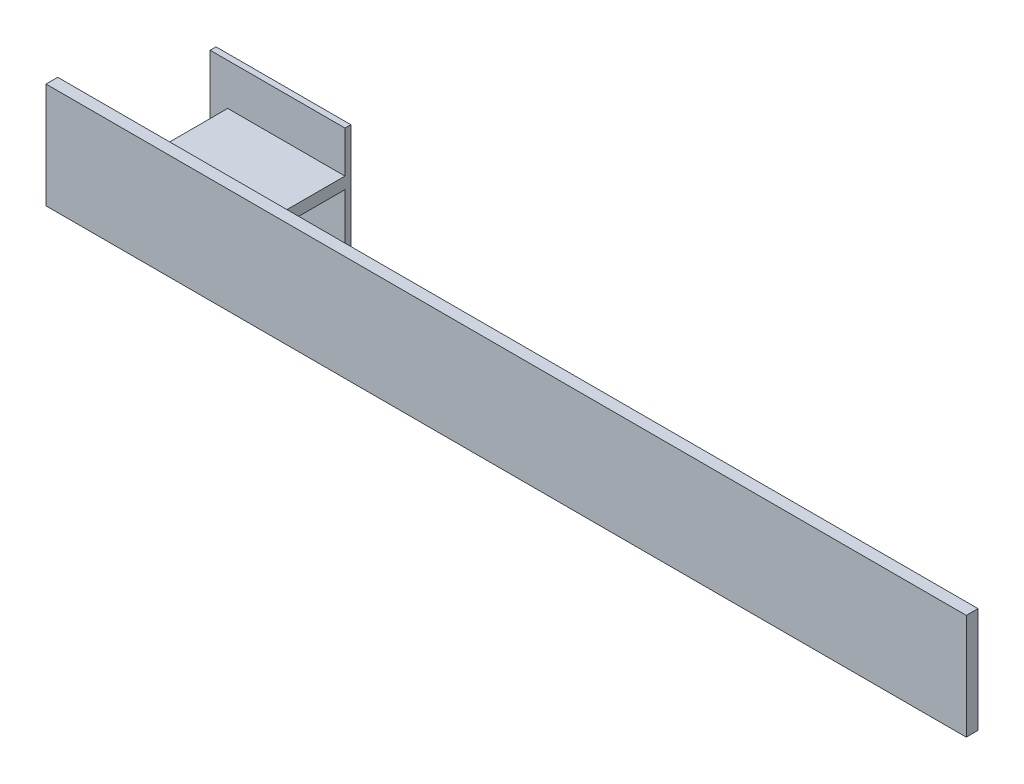
ISO-10303-21;
HEADER;
FILE_DESCRIPTION(('STEP AP214'),'2;1');
FILE_NAME('part.step','',(''),(''),'','','');
FILE_SCHEMA(('AUTOMOTIVE_DESIGN { 1 0 10303 214 1 1 1 1 }'));
ENDSEC;
DATA;
#1=APPLICATION_CONTEXT('core data for automotive mechanical design processes');
#2=APPLICATION_PROTOCOL_DEFINITION('international standard','automotive_design',2000,#1);
#3=PRODUCT_CONTEXT('',#1,'mechanical');
#4=PRODUCT('Part','Part','',(#3));
#5=PRODUCT_RELATED_PRODUCT_CATEGORY('part','',(#4));
#6=PRODUCT_DEFINITION_FORMATION('','',#4);
#7=PRODUCT_DEFINITION_CONTEXT('part definition',#1,'design');
#8=PRODUCT_DEFINITION('design','',#6,#7);
#9=PRODUCT_DEFINITION_SHAPE('','',#8);
#10=(LENGTH_UNIT() NAMED_UNIT(*) SI_UNIT(.MILLI.,.METRE.));
#11=(NAMED_UNIT(*) PLANE_ANGLE_UNIT() SI_UNIT($,.RADIAN.));
#12=(NAMED_UNIT(*) SI_UNIT($,.STERADIAN.) SOLID_ANGLE_UNIT());
#13=UNCERTAINTY_MEASURE_WITH_UNIT(LENGTH_MEASURE(1.E-05),#10,'distance_accuracy_value','');
#14=(GEOMETRIC_REPRESENTATION_CONTEXT(3) GLOBAL_UNCERTAINTY_ASSIGNED_CONTEXT((#13)) GLOBAL_UNIT_ASSIGNED_CONTEXT((#10,
#11,#12)) REPRESENTATION_CONTEXT('',''));
#15=CARTESIAN_POINT('',(0.,0.,0.));
#16=DIRECTION('',(0.,0.,1.));
#17=DIRECTION('',(1.,0.,0.));
#18=AXIS2_PLACEMENT_3D('',#15,#16,#17);
#19=CARTESIAN_POINT('',(0.,0.,0.));
#20=DIRECTION('',(0.,0.,-1.));
#21=DIRECTION('',(-1.,0.,0.));
#22=AXIS2_PLACEMENT_3D('',#19,#20,#21);
#23=PLANE('',#22);
#24=DIRECTION('',(0.,-1.,0.));
#25=VECTOR('',#24,1.);
#26=CARTESIAN_POINT('',(0.,0.,0.));
#27=LINE('',#26,#25);
#28=CARTESIAN_POINT('',(0.,18.,0.));
#29=VERTEX_POINT('',#28);
#30=CARTESIAN_POINT('',(0.,0.,0.));
#31=VERTEX_POINT('',#30);
#32=EDGE_CURVE('E190',#29,#31,#27,.T.);
#33=ORIENTED_EDGE('',*,*,#32,.F.);
#34=DIRECTION('',(-1.,0.,0.));
#35=VECTOR('',#34,1.);
#36=CARTESIAN_POINT('',(0.,18.,0.));
#37=LINE('',#36,#35);
#38=CARTESIAN_POINT('',(157.,18.,0.));
#39=VERTEX_POINT('',#38);
#40=EDGE_CURVE('E79',#39,#29,#37,.T.);
#41=ORIENTED_EDGE('',*,*,#40,.F.);
#42=DIRECTION('',(0.,1.,0.));
#43=VECTOR('',#42,1.);
#44=CARTESIAN_POINT('',(157.,0.,0.));
#45=LINE('',#44,#43);
#46=CARTESIAN_POINT('',(157.,0.,0.));
#47=VERTEX_POINT('',#46);
#48=EDGE_CURVE('E202',#47,#39,#45,.T.);
#49=ORIENTED_EDGE('',*,*,#48,.F.);
#50=DIRECTION('',(1.,0.,0.));
#51=VECTOR('',#50,1.);
#52=CARTESIAN_POINT('',(0.,0.,0.));
#53=LINE('',#52,#51);
#54=EDGE_CURVE('E200',#31,#47,#53,.T.);
#55=ORIENTED_EDGE('',*,*,#54,.F.);
#56=EDGE_LOOP('',(#33,#41,#49,#55));
#57=FACE_BOUND('',#56,.T.);
#58=DIRECTION('',(-1.,0.,0.));
#59=VECTOR('',#58,1.);
#60=CARTESIAN_POINT('',(12.,8.89999999999999,0.));
#61=LINE('',#60,#59);
#62=CARTESIAN_POINT('',(32.,8.89999999999999,0.));
#63=VERTEX_POINT('',#62);
#64=CARTESIAN_POINT('',(12.,8.89999999999999,0.));
#65=VERTEX_POINT('',#64);
#66=EDGE_CURVE('E161',#63,#65,#61,.T.);
#67=ORIENTED_EDGE('',*,*,#66,.F.);
#68=DIRECTION('',(0.,-1.,0.));
#69=VECTOR('',#68,1.);
#70=CARTESIAN_POINT('',(32.,8.89999999999999,0.));
#71=LINE('',#70,#69);
#72=CARTESIAN_POINT('',(32.,10.9,0.));
#73=VERTEX_POINT('',#72);
#74=EDGE_CURVE('E159',#73,#63,#71,.T.);
#75=ORIENTED_EDGE('',*,*,#74,.F.);
#76=DIRECTION('',(1.,0.,0.));
#77=VECTOR('',#76,1.);
#78=CARTESIAN_POINT('',(12.,10.9,0.));
#79=LINE('',#78,#77);
#80=CARTESIAN_POINT('',(12.,10.9,0.));
#81=VERTEX_POINT('',#80);
#82=EDGE_CURVE('E171',#81,#73,#79,.T.);
#83=ORIENTED_EDGE('',*,*,#82,.F.);
#84=DIRECTION('',(0.,1.,0.));
#85=VECTOR('',#84,1.);
#86=CARTESIAN_POINT('',(12.,8.89999999999999,0.));
#87=LINE('',#86,#85);
#88=EDGE_CURVE('E179',#65,#81,#87,.T.);
#89=ORIENTED_EDGE('',*,*,#88,.F.);
#90=EDGE_LOOP('',(#67,#75,#83,#89));
#91=FACE_BOUND('',#90,.T.);
#92=ADVANCED_FACE('F34',(#57,#91),#23,.T.);
#93=CARTESIAN_POINT('',(0.,0.,2.));
#94=DIRECTION('',(1.,0.,0.));
#95=DIRECTION('',(0.,0.,-1.));
#96=AXIS2_PLACEMENT_3D('',#93,#94,#95);
#97=PLANE('',#96);
#98=ORIENTED_EDGE('',*,*,#32,.T.);
#99=DIRECTION('',(0.,0.,-1.));
#100=VECTOR('',#99,1.);
#101=CARTESIAN_POINT('',(0.,0.,2.));
#102=LINE('',#101,#100);
#103=CARTESIAN_POINT('',(0.,0.,2.));
#104=VERTEX_POINT('',#103);
#105=EDGE_CURVE('E11',#104,#31,#102,.T.);
#106=ORIENTED_EDGE('',*,*,#105,.F.);
#107=DIRECTION('',(0.,-1.,0.));
#108=VECTOR('',#107,1.);
#109=CARTESIAN_POINT('',(0.,0.,2.));
#110=LINE('',#109,#108);
#111=CARTESIAN_POINT('',(0.,18.,2.));
#112=VERTEX_POINT('',#111);
#113=EDGE_CURVE('E191',#112,#104,#110,.T.);
#114=ORIENTED_EDGE('',*,*,#113,.F.);
#115=DIRECTION('',(0.,0.,-1.));
#116=VECTOR('',#115,1.);
#117=CARTESIAN_POINT('',(0.,18.,2.));
#118=LINE('',#117,#116);
#119=EDGE_CURVE('E197',#112,#29,#118,.T.);
#120=ORIENTED_EDGE('',*,*,#119,.T.);
#121=EDGE_LOOP('',(#98,#106,#114,#120));
#122=FACE_BOUND('',#121,.T.);
#123=ADVANCED_FACE('F36',(#122),#97,.F.);
#124=CARTESIAN_POINT('',(0.,0.,2.));
#125=DIRECTION('',(0.,1.,0.));
#126=DIRECTION('',(0.,0.,1.));
#127=AXIS2_PLACEMENT_3D('',#124,#125,#126);
#128=PLANE('',#127);
#129=ORIENTED_EDGE('',*,*,#54,.T.);
#130=DIRECTION('',(0.,0.,-1.));
#131=VECTOR('',#130,1.);
#132=CARTESIAN_POINT('',(157.,0.,2.));
#133=LINE('',#132,#131);
#134=CARTESIAN_POINT('',(157.,0.,2.));
#135=VERTEX_POINT('',#134);
#136=EDGE_CURVE('E42',#135,#47,#133,.T.);
#137=ORIENTED_EDGE('',*,*,#136,.F.);
#138=DIRECTION('',(1.,0.,0.));
#139=VECTOR('',#138,1.);
#140=CARTESIAN_POINT('',(0.,0.,2.));
#141=LINE('',#140,#139);
#142=EDGE_CURVE('E86',#104,#135,#141,.T.);
#143=ORIENTED_EDGE('',*,*,#142,.F.);
#144=ORIENTED_EDGE('',*,*,#105,.T.);
#145=EDGE_LOOP('',(#129,#137,#143,#144));
#146=FACE_BOUND('',#145,.T.);
#147=ADVANCED_FACE('F228',(#146),#128,.F.);
#148=CARTESIAN_POINT('',(157.,0.,2.));
#149=DIRECTION('',(-1.,0.,0.));
#150=DIRECTION('',(0.,0.,1.));
#151=AXIS2_PLACEMENT_3D('',#148,#149,#150);
#152=PLANE('',#151);
#153=ORIENTED_EDGE('',*,*,#48,.T.);
#154=DIRECTION('',(0.,0.,-1.));
#155=VECTOR('',#154,1.);
#156=CARTESIAN_POINT('',(157.,18.,2.));
#157=LINE('',#156,#155);
#158=CARTESIAN_POINT('',(157.,18.,2.));
#159=VERTEX_POINT('',#158);
#160=EDGE_CURVE('E206',#159,#39,#157,.T.);
#161=ORIENTED_EDGE('',*,*,#160,.F.);
#162=DIRECTION('',(0.,1.,0.));
#163=VECTOR('',#162,1.);
#164=CARTESIAN_POINT('',(157.,0.,2.));
#165=LINE('',#164,#163);
#166=EDGE_CURVE('E194',#135,#159,#165,.T.);
#167=ORIENTED_EDGE('',*,*,#166,.F.);
#168=ORIENTED_EDGE('',*,*,#136,.T.);
#169=EDGE_LOOP('',(#153,#161,#167,#168));
#170=FACE_BOUND('',#169,.T.);
#171=ADVANCED_FACE('F211',(#170),#152,.F.);
#172=CARTESIAN_POINT('',(0.,18.,2.));
#173=DIRECTION('',(0.,-1.,0.));
#174=DIRECTION('',(0.,0.,-1.));
#175=AXIS2_PLACEMENT_3D('',#172,#173,#174);
#176=PLANE('',#175);
#177=ORIENTED_EDGE('',*,*,#40,.T.);
#178=ORIENTED_EDGE('',*,*,#119,.F.);
#179=DIRECTION('',(-1.,0.,0.));
#180=VECTOR('',#179,1.);
#181=CARTESIAN_POINT('',(0.,18.,2.));
#182=LINE('',#181,#180);
#183=EDGE_CURVE('E58',#159,#112,#182,.T.);
#184=ORIENTED_EDGE('',*,*,#183,.F.);
#185=ORIENTED_EDGE('',*,*,#160,.T.);
#186=EDGE_LOOP('',(#177,#178,#184,#185));
#187=FACE_BOUND('',#186,.T.);
#188=ADVANCED_FACE('F219',(#187),#176,.F.);
#189=CARTESIAN_POINT('',(0.,0.,2.));
#190=DIRECTION('',(0.,0.,-1.));
#191=DIRECTION('',(-1.,0.,0.));
#192=AXIS2_PLACEMENT_3D('',#189,#190,#191);
#193=PLANE('',#192);
#194=ORIENTED_EDGE('',*,*,#113,.T.);
#195=ORIENTED_EDGE('',*,*,#142,.T.);
#196=ORIENTED_EDGE('',*,*,#166,.T.);
#197=ORIENTED_EDGE('',*,*,#183,.T.);
#198=EDGE_LOOP('',(#194,#195,#196,#197));
#199=FACE_BOUND('',#198,.T.);
#200=ADVANCED_FACE('F221',(#199),#193,.F.);
#201=CARTESIAN_POINT('',(32.,8.89999999999999,-17.));
#202=DIRECTION('',(-1.,0.,0.));
#203=DIRECTION('',(0.,0.,1.));
#204=AXIS2_PLACEMENT_3D('',#201,#202,#203);
#205=PLANE('',#204);
#206=ORIENTED_EDGE('',*,*,#74,.T.);
#207=DIRECTION('',(0.,0.,1.));
#208=VECTOR('',#207,1.);
#209=CARTESIAN_POINT('',(32.,8.89999999999999,-17.));
#210=LINE('',#209,#208);
#211=CARTESIAN_POINT('',(32.,8.89999999999999,-17.));
#212=VERTEX_POINT('',#211);
#213=EDGE_CURVE('E188',#212,#63,#210,.T.);
#214=ORIENTED_EDGE('',*,*,#213,.F.);
#215=DIRECTION('',(0.,-1.,0.));
#216=VECTOR('',#215,1.);
#217=CARTESIAN_POINT('',(32.,18.,-17.));
#218=LINE('',#217,#216);
#219=CARTESIAN_POINT('',(32.,0.,-17.));
#220=VERTEX_POINT('',#219);
#221=EDGE_CURVE('E157',#212,#220,#218,.T.);
#222=ORIENTED_EDGE('',*,*,#221,.T.);
#223=DIRECTION('',(0.,0.,1.));
#224=VECTOR('',#223,1.);
#225=CARTESIAN_POINT('',(32.,0.,-18.));
#226=LINE('',#225,#224);
#227=CARTESIAN_POINT('',(32.,0.,-18.));
#228=VERTEX_POINT('',#227);
#229=EDGE_CURVE('E136',#228,#220,#226,.T.);
#230=ORIENTED_EDGE('',*,*,#229,.F.);
#231=DIRECTION('',(0.,-1.,0.));
#232=VECTOR('',#231,1.);
#233=CARTESIAN_POINT('',(32.,18.,-18.));
#234=LINE('',#233,#232);
#235=CARTESIAN_POINT('',(32.,18.,-18.));
#236=VERTEX_POINT('',#235);
#237=EDGE_CURVE('E142',#236,#228,#234,.T.);
#238=ORIENTED_EDGE('',*,*,#237,.F.);
#239=DIRECTION('',(0.,0.,1.));
#240=VECTOR('',#239,1.);
#241=CARTESIAN_POINT('',(32.,18.,-18.));
#242=LINE('',#241,#240);
#243=CARTESIAN_POINT('',(32.,18.,-17.));
#244=VERTEX_POINT('',#243);
#245=EDGE_CURVE('E366',#236,#244,#242,.T.);
#246=ORIENTED_EDGE('',*,*,#245,.T.);
#247=CARTESIAN_POINT('',(32.,10.9,-17.));
#248=VERTEX_POINT('',#247);
#249=EDGE_CURVE('E356',#244,#248,#218,.T.);
#250=ORIENTED_EDGE('',*,*,#249,.T.);
#251=DIRECTION('',(0.,0.,1.));
#252=VECTOR('',#251,1.);
#253=CARTESIAN_POINT('',(32.,10.9,-17.));
#254=LINE('',#253,#252);
#255=EDGE_CURVE('E176',#248,#73,#254,.T.);
#256=ORIENTED_EDGE('',*,*,#255,.T.);
#257=EDGE_LOOP('',(#206,#214,#222,#230,#238,#246,#250,#256));
#258=FACE_BOUND('',#257,.T.);
#259=ADVANCED_FACE('F154',(#258),#205,.F.);
#260=CARTESIAN_POINT('',(12.,8.89999999999999,-17.));
#261=DIRECTION('',(0.,1.,0.));
#262=DIRECTION('',(-1.,0.,0.));
#263=AXIS2_PLACEMENT_3D('',#260,#261,#262);
#264=PLANE('',#263);
#265=ORIENTED_EDGE('',*,*,#66,.T.);
#266=DIRECTION('',(0.,0.,1.));
#267=VECTOR('',#266,1.);
#268=CARTESIAN_POINT('',(12.,8.89999999999999,-17.));
#269=LINE('',#268,#267);
#270=CARTESIAN_POINT('',(12.,8.89999999999999,-17.));
#271=VERTEX_POINT('',#270);
#272=EDGE_CURVE('E185',#271,#65,#269,.T.);
#273=ORIENTED_EDGE('',*,*,#272,.F.);
#274=DIRECTION('',(-1.,0.,0.));
#275=VECTOR('',#274,1.);
#276=CARTESIAN_POINT('',(12.,8.89999999999999,-17.));
#277=LINE('',#276,#275);
#278=EDGE_CURVE('E167',#212,#271,#277,.T.);
#279=ORIENTED_EDGE('',*,*,#278,.F.);
#280=ORIENTED_EDGE('',*,*,#213,.T.);
#281=EDGE_LOOP('',(#265,#273,#279,#280));
#282=FACE_BOUND('',#281,.T.);
#283=ADVANCED_FACE('F238',(#282),#264,.F.);
#284=CARTESIAN_POINT('',(12.,8.89999999999999,-17.));
#285=DIRECTION('',(1.,0.,0.));
#286=DIRECTION('',(0.,0.,-1.));
#287=AXIS2_PLACEMENT_3D('',#284,#285,#286);
#288=PLANE('',#287);
#289=ORIENTED_EDGE('',*,*,#88,.T.);
#290=DIRECTION('',(0.,0.,1.));
#291=VECTOR('',#290,1.);
#292=CARTESIAN_POINT('',(12.,10.9,-17.));
#293=LINE('',#292,#291);
#294=CARTESIAN_POINT('',(12.,10.9,-17.));
#295=VERTEX_POINT('',#294);
#296=EDGE_CURVE('E49',#295,#81,#293,.T.);
#297=ORIENTED_EDGE('',*,*,#296,.F.);
#298=DIRECTION('',(0.,1.,0.));
#299=VECTOR('',#298,1.);
#300=CARTESIAN_POINT('',(12.,8.89999999999999,-17.));
#301=LINE('',#300,#299);
#302=EDGE_CURVE('E170',#271,#295,#301,.T.);
#303=ORIENTED_EDGE('',*,*,#302,.F.);
#304=ORIENTED_EDGE('',*,*,#272,.T.);
#305=EDGE_LOOP('',(#289,#297,#303,#304));
#306=FACE_BOUND('',#305,.T.);
#307=ADVANCED_FACE('F241',(#306),#288,.F.);
#308=CARTESIAN_POINT('',(12.,10.9,-17.));
#309=DIRECTION('',(0.,-1.,0.));
#310=DIRECTION('',(1.,0.,0.));
#311=AXIS2_PLACEMENT_3D('',#308,#309,#310);
#312=PLANE('',#311);
#313=ORIENTED_EDGE('',*,*,#82,.T.);
#314=ORIENTED_EDGE('',*,*,#255,.F.);
#315=DIRECTION('',(1.,0.,0.));
#316=VECTOR('',#315,1.);
#317=CARTESIAN_POINT('',(12.,10.9,-17.));
#318=LINE('',#317,#316);
#319=EDGE_CURVE('E174',#295,#248,#318,.T.);
#320=ORIENTED_EDGE('',*,*,#319,.F.);
#321=ORIENTED_EDGE('',*,*,#296,.T.);
#322=EDGE_LOOP('',(#313,#314,#320,#321));
#323=FACE_BOUND('',#322,.T.);
#324=ADVANCED_FACE('F245',(#323),#312,.F.);
#325=CARTESIAN_POINT('',(0.,0.,-17.));
#326=DIRECTION('',(0.,0.,-1.));
#327=DIRECTION('',(-1.,0.,0.));
#328=AXIS2_PLACEMENT_3D('',#325,#326,#327);
#329=PLANE('',#328);
#330=ORIENTED_EDGE('',*,*,#221,.F.);
#331=ORIENTED_EDGE('',*,*,#278,.T.);
#332=ORIENTED_EDGE('',*,*,#302,.T.);
#333=ORIENTED_EDGE('',*,*,#319,.T.);
#334=ORIENTED_EDGE('',*,*,#249,.F.);
#335=DIRECTION('',(1.,0.,0.));
#336=VECTOR('',#335,1.);
#337=CARTESIAN_POINT('',(32.,18.,-17.));
#338=LINE('',#337,#336);
#339=CARTESIAN_POINT('',(9.,18.,-17.));
#340=VERTEX_POINT('',#339);
#341=EDGE_CURVE('E151',#340,#244,#338,.T.);
#342=ORIENTED_EDGE('',*,*,#341,.F.);
#343=DIRECTION('',(0.,1.,0.));
#344=VECTOR('',#343,1.);
#345=CARTESIAN_POINT('',(9.,18.,-17.));
#346=LINE('',#345,#344);
#347=CARTESIAN_POINT('',(9.,0.,-17.));
#348=VERTEX_POINT('',#347);
#349=EDGE_CURVE('E363',#348,#340,#346,.T.);
#350=ORIENTED_EDGE('',*,*,#349,.F.);
#351=DIRECTION('',(-1.,0.,0.));
#352=VECTOR('',#351,1.);
#353=CARTESIAN_POINT('',(32.,0.,-17.));
#354=LINE('',#353,#352);
#355=EDGE_CURVE('E355',#220,#348,#354,.T.);
#356=ORIENTED_EDGE('',*,*,#355,.F.);
#357=EDGE_LOOP('',(#330,#331,#332,#333,#334,#342,#350,#356));
#358=FACE_BOUND('',#357,.T.);
#359=ADVANCED_FACE('F249',(#358),#329,.F.);
#360=CARTESIAN_POINT('',(32.,0.,-18.));
#361=DIRECTION('',(0.,1.,0.));
#362=DIRECTION('',(0.,0.,1.));
#363=AXIS2_PLACEMENT_3D('',#360,#361,#362);
#364=PLANE('',#363);
#365=ORIENTED_EDGE('',*,*,#355,.T.);
#366=DIRECTION('',(0.,0.,1.));
#367=VECTOR('',#366,1.);
#368=CARTESIAN_POINT('',(9.,0.,-18.));
#369=LINE('',#368,#367);
#370=CARTESIAN_POINT('',(9.,0.,-18.));
#371=VERTEX_POINT('',#370);
#372=EDGE_CURVE('E138',#371,#348,#369,.T.);
#373=ORIENTED_EDGE('',*,*,#372,.F.);
#374=DIRECTION('',(-1.,0.,0.));
#375=VECTOR('',#374,1.);
#376=CARTESIAN_POINT('',(32.,0.,-18.));
#377=LINE('',#376,#375);
#378=EDGE_CURVE('E132',#228,#371,#377,.T.);
#379=ORIENTED_EDGE('',*,*,#378,.F.);
#380=ORIENTED_EDGE('',*,*,#229,.T.);
#381=EDGE_LOOP('',(#365,#373,#379,#380));
#382=FACE_BOUND('',#381,.T.);
#383=ADVANCED_FACE('F134',(#382),#364,.F.);
#384=CARTESIAN_POINT('',(9.,18.,-18.));
#385=DIRECTION('',(1.,0.,0.));
#386=DIRECTION('',(0.,1.,0.));
#387=AXIS2_PLACEMENT_3D('',#384,#385,#386);
#388=PLANE('',#387);
#389=ORIENTED_EDGE('',*,*,#349,.T.);
#390=DIRECTION('',(0.,0.,1.));
#391=VECTOR('',#390,1.);
#392=CARTESIAN_POINT('',(9.,18.,-18.));
#393=LINE('',#392,#391);
#394=CARTESIAN_POINT('',(9.,18.,-18.));
#395=VERTEX_POINT('',#394);
#396=EDGE_CURVE('E163',#395,#340,#393,.T.);
#397=ORIENTED_EDGE('',*,*,#396,.F.);
#398=DIRECTION('',(0.,1.,0.));
#399=VECTOR('',#398,1.);
#400=CARTESIAN_POINT('',(9.,18.,-18.));
#401=LINE('',#400,#399);
#402=EDGE_CURVE('E141',#371,#395,#401,.T.);
#403=ORIENTED_EDGE('',*,*,#402,.F.);
#404=ORIENTED_EDGE('',*,*,#372,.T.);
#405=EDGE_LOOP('',(#389,#397,#403,#404));
#406=FACE_BOUND('',#405,.T.);
#407=ADVANCED_FACE('F252',(#406),#388,.F.);
#408=CARTESIAN_POINT('',(32.,18.,-18.));
#409=DIRECTION('',(0.,-1.,0.));
#410=DIRECTION('',(1.,0.,0.));
#411=AXIS2_PLACEMENT_3D('',#408,#409,#410);
#412=PLANE('',#411);
#413=ORIENTED_EDGE('',*,*,#341,.T.);
#414=ORIENTED_EDGE('',*,*,#245,.F.);
#415=DIRECTION('',(1.,0.,0.));
#416=VECTOR('',#415,1.);
#417=CARTESIAN_POINT('',(32.,18.,-18.));
#418=LINE('',#417,#416);
#419=EDGE_CURVE('E147',#395,#236,#418,.T.);
#420=ORIENTED_EDGE('',*,*,#419,.F.);
#421=ORIENTED_EDGE('',*,*,#396,.T.);
#422=EDGE_LOOP('',(#413,#414,#420,#421));
#423=FACE_BOUND('',#422,.T.);
#424=ADVANCED_FACE('F255',(#423),#412,.F.);
#425=CARTESIAN_POINT('',(0.,0.,-18.));
#426=DIRECTION('',(0.,0.,-1.));
#427=DIRECTION('',(-1.,0.,0.));
#428=AXIS2_PLACEMENT_3D('',#425,#426,#427);
#429=PLANE('',#428);
#430=ORIENTED_EDGE('',*,*,#237,.T.);
#431=ORIENTED_EDGE('',*,*,#378,.T.);
#432=ORIENTED_EDGE('',*,*,#402,.T.);
#433=ORIENTED_EDGE('',*,*,#419,.T.);
#434=EDGE_LOOP('',(#430,#431,#432,#433));
#435=FACE_BOUND('',#434,.T.);
#436=ADVANCED_FACE('F145',(#435),#429,.T.);
#437=CLOSED_SHELL('',(#92,#123,#147,#171,#188,#200,#259,#283,#307,#324,#359,#383,#407,#424,#436));
#438=MANIFOLD_SOLID_BREP('B2',#437);
#439=ADVANCED_BREP_SHAPE_REPRESENTATION('',(#18,#438),#14);
#440=SHAPE_DEFINITION_REPRESENTATION(#9,#439);
ENDSEC;
END-ISO-10303-21;
